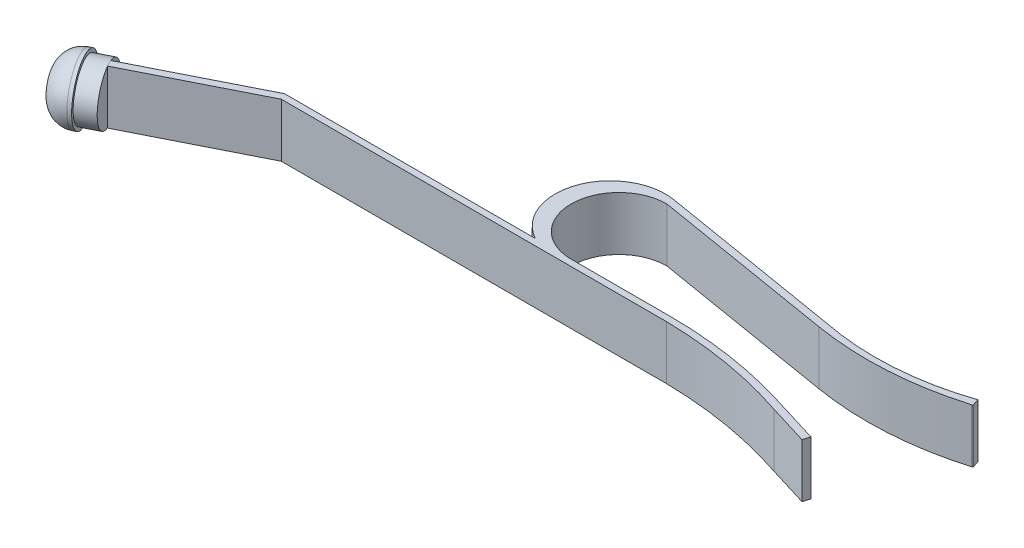
ISO-10303-21;
HEADER;
FILE_DESCRIPTION(('STEP AP214'),'2;1');
FILE_NAME('part.step','',(''),(''),'','','');
FILE_SCHEMA(('AUTOMOTIVE_DESIGN { 1 0 10303 214 1 1 1 1 }'));
ENDSEC;
DATA;
#1=APPLICATION_CONTEXT('core data for automotive mechanical design processes');
#2=APPLICATION_PROTOCOL_DEFINITION('international standard','automotive_design',2000,#1);
#3=PRODUCT_CONTEXT('',#1,'mechanical');
#4=PRODUCT('Part','Part','',(#3));
#5=PRODUCT_RELATED_PRODUCT_CATEGORY('part','',(#4));
#6=PRODUCT_DEFINITION_FORMATION('','',#4);
#7=PRODUCT_DEFINITION_CONTEXT('part definition',#1,'design');
#8=PRODUCT_DEFINITION('design','',#6,#7);
#9=PRODUCT_DEFINITION_SHAPE('','',#8);
#10=(LENGTH_UNIT() NAMED_UNIT(*) SI_UNIT(.MILLI.,.METRE.));
#11=(NAMED_UNIT(*) PLANE_ANGLE_UNIT() SI_UNIT($,.RADIAN.));
#12=(NAMED_UNIT(*) SI_UNIT($,.STERADIAN.) SOLID_ANGLE_UNIT());
#13=UNCERTAINTY_MEASURE_WITH_UNIT(LENGTH_MEASURE(1.E-05),#10,'distance_accuracy_value','');
#14=(GEOMETRIC_REPRESENTATION_CONTEXT(3) GLOBAL_UNCERTAINTY_ASSIGNED_CONTEXT((#13)) GLOBAL_UNIT_ASSIGNED_CONTEXT((#10,
#11,#12)) REPRESENTATION_CONTEXT('',''));
#15=CARTESIAN_POINT('',(0.,0.,0.));
#16=DIRECTION('',(0.,0.,1.));
#17=DIRECTION('',(1.,0.,0.));
#18=AXIS2_PLACEMENT_3D('',#15,#16,#17);
#19=CARTESIAN_POINT('',(-162.619391372233,7.50804054568903,19.8202176723908));
#20=DIRECTION('',(-0.893385957066227,0.,0.449290030733893));
#21=DIRECTION('',(0.449290030733893,0.,0.893385957066227));
#22=AXIS2_PLACEMENT_3D('',#19,#20,#21);
#23=DEGENERATE_TOROIDAL_SURFACE('',#22,2.4409494801451,6.,.T.);
#24=CARTESIAN_POINT('',(-167.979707114631,7.50804054568903,22.5159578567941));
#25=DIRECTION('',(-0.893385957066227,0.,0.449290030733893));
#26=DIRECTION('',(0.449290030733893,0.,0.893385957066227));
#27=AXIS2_PLACEMENT_3D('',#24,#25,#26);
#28=CIRCLE('',#27,2.4409494801451);
#29=CARTESIAN_POINT('',(-166.883012847676,7.50804054568903,24.6966678442639));
#30=VERTEX_POINT('',#29);
#31=EDGE_CURVE('E47',#30,#30,#28,.T.);
#32=ORIENTED_EDGE('',*,*,#31,.F.);
#33=EDGE_LOOP('',(#32));
#34=FACE_BOUND('',#33,.T.);
#35=CARTESIAN_POINT('',(-162.619391372233,7.50804054568903,19.8202176723908));
#36=DIRECTION('',(-0.893385957066227,0.,0.449290030733893));
#37=DIRECTION('',(0.449290030733893,0.,0.893385957066227));
#38=AXIS2_PLACEMENT_3D('',#35,#36,#37);
#39=CIRCLE('',#38,8.4409494801451);
#40=CARTESIAN_POINT('',(-158.826956920876,7.50804054568903,27.3612434022579));
#41=VERTEX_POINT('',#40);
#42=EDGE_CURVE('E11',#41,#41,#39,.F.);
#43=ORIENTED_EDGE('',*,*,#42,.F.);
#44=EDGE_LOOP('',(#43));
#45=FACE_BOUND('',#44,.T.);
#46=ADVANCED_FACE('F39',(#34,#45),#23,.T.);
#47=CARTESIAN_POINT('',(-157.707883988967,15.,16.2320493056686));
#48=DIRECTION('',(0.893385957066227,0.,-0.449290030733893));
#49=DIRECTION('',(-0.449290030733893,0.,-0.893385957066227));
#50=AXIS2_PLACEMENT_3D('',#47,#48,#49);
#51=PLANE('',#50);
#52=CARTESIAN_POINT('',(-157.259075629836,7.50804054568903,17.1244774879874));
#53=DIRECTION('',(-0.893385957066227,0.,0.449290030733893));
#54=DIRECTION('',(0.449290030733893,0.,0.893385957066227));
#55=AXIS2_PLACEMENT_3D('',#52,#53,#54);
#56=CIRCLE('',#55,7.49070603260002);
#57=CARTESIAN_POINT('',(-156.809303927499,14.931552623673,18.0188212198011));
#58=VERTEX_POINT('',#57);
#59=CARTESIAN_POINT('',(-157.707883988967,14.9318414497413,16.2320493056686));
#60=VERTEX_POINT('',#59);
#61=EDGE_CURVE('E210',#58,#60,#56,.T.);
#62=ORIENTED_EDGE('',*,*,#61,.F.);
#63=DIRECTION('',(0.,-1.,0.));
#64=VECTOR('',#63,1.);
#65=CARTESIAN_POINT('',(-156.809303927499,15.,18.0188212198011));
#66=LINE('',#65,#64);
#67=CARTESIAN_POINT('',(-156.809303927499,15.,18.0188212198011));
#68=VERTEX_POINT('',#67);
#69=EDGE_CURVE('E190',#68,#58,#66,.T.);
#70=ORIENTED_EDGE('',*,*,#69,.F.);
#71=DIRECTION('',(0.449290030733893,0.,0.893385957066227));
#72=VECTOR('',#71,1.);
#73=CARTESIAN_POINT('',(-157.707883988967,15.,16.2320493056686));
#74=LINE('',#73,#72);
#75=CARTESIAN_POINT('',(-157.707883988967,15.,16.2320493056686));
#76=VERTEX_POINT('',#75);
#77=EDGE_CURVE('E414',#76,#68,#74,.T.);
#78=ORIENTED_EDGE('',*,*,#77,.F.);
#79=DIRECTION('',(0.,-1.,0.));
#80=VECTOR('',#79,1.);
#81=CARTESIAN_POINT('',(-157.707883988967,15.,16.2320493056686));
#82=LINE('',#81,#80);
#83=EDGE_CURVE('E335',#76,#60,#82,.T.);
#84=ORIENTED_EDGE('',*,*,#83,.T.);
#85=EDGE_LOOP('',(#62,#70,#78,#84));
#86=FACE_BOUND('',#85,.T.);
#87=ADVANCED_FACE('F461',(#86),#51,.F.);
#88=CARTESIAN_POINT('',(-45.4314391268288,15.,-13.3557871081369));
#89=DIRECTION('',(0.,-1.,0.));
#90=DIRECTION('',(0.,0.,-1.));
#91=AXIS2_PLACEMENT_3D('',#88,#89,#90);
#92=CYLINDRICAL_SURFACE('',#91,13.3557871081369);
#93=CARTESIAN_POINT('',(-45.4314391268288,0.,-13.3557871081369));
#94=DIRECTION('',(0.,-1.,0.));
#95=DIRECTION('',(0.,0.,-1.));
#96=AXIS2_PLACEMENT_3D('',#93,#94,#95);
#97=CIRCLE('',#96,13.3557871081369);
#98=CARTESIAN_POINT('',(-45.4314391268288,0.,0.));
#99=VERTEX_POINT('',#98);
#100=CARTESIAN_POINT('',(-45.4314391268288,0.,-26.7115742162738));
#101=VERTEX_POINT('',#100);
#102=EDGE_CURVE('E234',#99,#101,#97,.T.);
#103=ORIENTED_EDGE('',*,*,#102,.T.);
#104=DIRECTION('',(0.,-1.,0.));
#105=VECTOR('',#104,1.);
#106=CARTESIAN_POINT('',(-45.4314391268288,15.,-26.7115742162738));
#107=LINE('',#106,#105);
#108=CARTESIAN_POINT('',(-45.4314391268288,15.,-26.7115742162738));
#109=VERTEX_POINT('',#108);
#110=EDGE_CURVE('E215',#109,#101,#107,.T.);
#111=ORIENTED_EDGE('',*,*,#110,.F.);
#112=CARTESIAN_POINT('',(-45.4314391268288,15.,-13.3557871081369));
#113=DIRECTION('',(0.,-1.,0.));
#114=DIRECTION('',(0.,0.,-1.));
#115=AXIS2_PLACEMENT_3D('',#112,#113,#114);
#116=CIRCLE('',#115,13.3557871081369);
#117=CARTESIAN_POINT('',(-45.4314391268288,15.,0.));
#118=VERTEX_POINT('',#117);
#119=EDGE_CURVE('E302',#118,#109,#116,.T.);
#120=ORIENTED_EDGE('',*,*,#119,.F.);
#121=DIRECTION('',(0.,-1.,0.));
#122=VECTOR('',#121,1.);
#123=CARTESIAN_POINT('',(-45.4314391268288,15.,0.));
#124=LINE('',#123,#122);
#125=EDGE_CURVE('E303',#118,#99,#124,.T.);
#126=ORIENTED_EDGE('',*,*,#125,.T.);
#127=EDGE_LOOP('',(#103,#111,#120,#126));
#128=FACE_BOUND('',#127,.T.);
#129=ADVANCED_FACE('F447',(#128),#92,.F.);
#130=CARTESIAN_POINT('',(-45.4314391268288,15.,-26.7115742162738));
#131=DIRECTION('',(0.163980210514114,0.,-0.986463628604596));
#132=DIRECTION('',(-0.986463628604596,0.,-0.163980210514114));
#133=AXIS2_PLACEMENT_3D('',#130,#131,#132);
#134=PLANE('',#133);
#135=DIRECTION('',(0.986463628604596,0.,0.163980210514114));
#136=VECTOR('',#135,1.);
#137=CARTESIAN_POINT('',(-45.4314391268288,0.,-26.7115742162738));
#138=LINE('',#137,#136);
#139=CARTESIAN_POINT('',(5.45092280961635,0.,-18.2533805435926));
#140=VERTEX_POINT('',#139);
#141=EDGE_CURVE('E239',#101,#140,#138,.T.);
#142=ORIENTED_EDGE('',*,*,#141,.T.);
#143=DIRECTION('',(0.,-1.,0.));
#144=VECTOR('',#143,1.);
#145=CARTESIAN_POINT('',(5.45092280961635,15.,-18.2533805435926));
#146=LINE('',#145,#144);
#147=CARTESIAN_POINT('',(5.45092280961635,15.,-18.2533805435926));
#148=VERTEX_POINT('',#147);
#149=EDGE_CURVE('E220',#148,#140,#146,.T.);
#150=ORIENTED_EDGE('',*,*,#149,.F.);
#151=DIRECTION('',(0.986463628604596,0.,0.163980210514114));
#152=VECTOR('',#151,1.);
#153=CARTESIAN_POINT('',(-45.4314391268288,15.,-26.7115742162738));
#154=LINE('',#153,#152);
#155=EDGE_CURVE('E449',#109,#148,#154,.T.);
#156=ORIENTED_EDGE('',*,*,#155,.F.);
#157=ORIENTED_EDGE('',*,*,#110,.T.);
#158=EDGE_LOOP('',(#142,#150,#156,#157));
#159=FACE_BOUND('',#158,.T.);
#160=ADVANCED_FACE('F453',(#159),#134,.F.);
#161=CARTESIAN_POINT('',(20.2091417558867,15.,-107.035107118006));
#162=DIRECTION('',(0.,-1.,0.));
#163=DIRECTION('',(0.,0.,-1.));
#164=AXIS2_PLACEMENT_3D('',#161,#162,#163);
#165=CYLINDRICAL_SURFACE('',#164,90.);
#166=CARTESIAN_POINT('',(20.2091417558867,0.,-107.035107118006));
#167=DIRECTION('',(0.,1.,0.));
#168=DIRECTION('',(0.,0.,1.));
#169=AXIS2_PLACEMENT_3D('',#166,#167,#168);
#170=CIRCLE('',#169,90.);
#171=CARTESIAN_POINT('',(45.5932894480546,0.,-20.6890299289283));
#172=VERTEX_POINT('',#171);
#173=EDGE_CURVE('E246',#140,#172,#170,.T.);
#174=ORIENTED_EDGE('',*,*,#173,.T.);
#175=DIRECTION('',(0.,-1.,0.));
#176=VECTOR('',#175,1.);
#177=CARTESIAN_POINT('',(45.5932894480546,15.,-20.6890299289283));
#178=LINE('',#177,#176);
#179=CARTESIAN_POINT('',(45.5932894480546,15.,-20.6890299289283));
#180=VERTEX_POINT('',#179);
#181=EDGE_CURVE('E362',#180,#172,#178,.T.);
#182=ORIENTED_EDGE('',*,*,#181,.F.);
#183=CARTESIAN_POINT('',(20.2091417558867,15.,-107.035107118006));
#184=DIRECTION('',(0.,1.,0.));
#185=DIRECTION('',(0.,0.,1.));
#186=AXIS2_PLACEMENT_3D('',#183,#184,#185);
#187=CIRCLE('',#186,90.);
#188=EDGE_CURVE('E374',#148,#180,#187,.T.);
#189=ORIENTED_EDGE('',*,*,#188,.F.);
#190=ORIENTED_EDGE('',*,*,#149,.T.);
#191=EDGE_LOOP('',(#174,#182,#189,#190));
#192=FACE_BOUND('',#191,.T.);
#193=ADVANCED_FACE('F372',(#192),#165,.T.);
#194=CARTESIAN_POINT('',(45.5932894480546,15.,-20.6890299289283));
#195=DIRECTION('',(-0.282046085468501,0.,-0.959400857656431));
#196=DIRECTION('',(-0.959400857656431,0.,0.282046085468501));
#197=AXIS2_PLACEMENT_3D('',#194,#195,#196);
#198=PLANE('',#197);
#199=DIRECTION('',(0.959400857656431,0.,-0.282046085468501));
#200=VECTOR('',#199,1.);
#201=CARTESIAN_POINT('',(45.5932894480546,0.,-20.6890299289283));
#202=LINE('',#201,#200);
#203=CARTESIAN_POINT('',(45.9403386357963,0.,-20.7910559632875));
#204=VERTEX_POINT('',#203);
#205=EDGE_CURVE('E254',#172,#204,#202,.T.);
#206=ORIENTED_EDGE('',*,*,#205,.T.);
#207=DIRECTION('',(0.,-1.,0.));
#208=VECTOR('',#207,1.);
#209=CARTESIAN_POINT('',(45.9403386357963,15.,-20.7910559632875));
#210=LINE('',#209,#208);
#211=CARTESIAN_POINT('',(45.9403386357963,15.,-20.7910559632875));
#212=VERTEX_POINT('',#211);
#213=EDGE_CURVE('E358',#212,#204,#210,.T.);
#214=ORIENTED_EDGE('',*,*,#213,.F.);
#215=DIRECTION('',(0.959400857656431,0.,-0.282046085468501));
#216=VECTOR('',#215,1.);
#217=CARTESIAN_POINT('',(45.5932894480546,15.,-20.6890299289283));
#218=LINE('',#217,#216);
#219=EDGE_CURVE('E394',#180,#212,#218,.T.);
#220=ORIENTED_EDGE('',*,*,#219,.F.);
#221=ORIENTED_EDGE('',*,*,#181,.T.);
#222=EDGE_LOOP('',(#206,#214,#220,#221));
#223=FACE_BOUND('',#222,.T.);
#224=ADVANCED_FACE('F383',(#223),#198,.F.);
#225=CARTESIAN_POINT('',(45.9403386357963,15.,-20.7910559632875));
#226=DIRECTION('',(-0.959400857656431,0.,0.282046085468501));
#227=DIRECTION('',(0.282046085468501,0.,0.959400857656431));
#228=AXIS2_PLACEMENT_3D('',#225,#226,#227);
#229=PLANE('',#228);
#230=DIRECTION('',(-0.282046085468501,0.,-0.959400857656431));
#231=VECTOR('',#230,1.);
#232=CARTESIAN_POINT('',(45.9403386357963,0.,-20.7910559632875));
#233=LINE('',#232,#231);
#234=CARTESIAN_POINT('',(45.3523756728333,0.,-22.7910559632876));
#235=VERTEX_POINT('',#234);
#236=EDGE_CURVE('E257',#204,#235,#233,.T.);
#237=ORIENTED_EDGE('',*,*,#236,.T.);
#238=DIRECTION('',(0.,-1.,0.));
#239=VECTOR('',#238,1.);
#240=CARTESIAN_POINT('',(45.3523756728333,15.,-22.7910559632876));
#241=LINE('',#240,#239);
#242=CARTESIAN_POINT('',(45.3523756728333,15.,-22.7910559632876));
#243=VERTEX_POINT('',#242);
#244=EDGE_CURVE('E354',#243,#235,#241,.T.);
#245=ORIENTED_EDGE('',*,*,#244,.F.);
#246=DIRECTION('',(-0.282046085468501,0.,-0.959400857656431));
#247=VECTOR('',#246,1.);
#248=CARTESIAN_POINT('',(45.9403386357963,15.,-20.7910559632875));
#249=LINE('',#248,#247);
#250=EDGE_CURVE('E389',#212,#243,#249,.T.);
#251=ORIENTED_EDGE('',*,*,#250,.F.);
#252=ORIENTED_EDGE('',*,*,#213,.T.);
#253=EDGE_LOOP('',(#237,#245,#251,#252));
#254=FACE_BOUND('',#253,.T.);
#255=ADVANCED_FACE('F387',(#254),#229,.F.);
#256=CARTESIAN_POINT('',(20.6871980269933,15.,-95.3334724912764));
#257=DIRECTION('',(0.,-1.,0.));
#258=DIRECTION('',(0.,0.,-1.));
#259=AXIS2_PLACEMENT_3D('',#256,#257,#258);
#260=CYLINDRICAL_SURFACE('',#259,76.6209709154163);
#261=CARTESIAN_POINT('',(20.6871980269933,0.,-95.3334724912764));
#262=DIRECTION('',(0.,-1.,0.));
#263=DIRECTION('',(0.,0.,1.));
#264=AXIS2_PLACEMENT_3D('',#261,#262,#263);
#265=CIRCLE('',#264,76.6209709154163);
#266=CARTESIAN_POINT('',(5.45092280961642,0.,-20.2426667856415));
#267=VERTEX_POINT('',#266);
#268=EDGE_CURVE('E260',#235,#267,#265,.T.);
#269=ORIENTED_EDGE('',*,*,#268,.T.);
#270=DIRECTION('',(0.,-1.,0.));
#271=VECTOR('',#270,1.);
#272=CARTESIAN_POINT('',(5.45092280961642,15.,-20.2426667856415));
#273=LINE('',#272,#271);
#274=CARTESIAN_POINT('',(5.45092280961642,15.,-20.2426667856415));
#275=VERTEX_POINT('',#274);
#276=EDGE_CURVE('E350',#275,#267,#273,.T.);
#277=ORIENTED_EDGE('',*,*,#276,.F.);
#278=CARTESIAN_POINT('',(20.6871980269933,15.,-95.3334724912764));
#279=DIRECTION('',(0.,-1.,0.));
#280=DIRECTION('',(0.,0.,1.));
#281=AXIS2_PLACEMENT_3D('',#278,#279,#280);
#282=CIRCLE('',#281,76.6209709154163);
#283=EDGE_CURVE('E393',#243,#275,#282,.T.);
#284=ORIENTED_EDGE('',*,*,#283,.F.);
#285=ORIENTED_EDGE('',*,*,#244,.T.);
#286=EDGE_LOOP('',(#269,#277,#284,#285));
#287=FACE_BOUND('',#286,.T.);
#288=ADVANCED_FACE('F538',(#287),#260,.F.);
#289=CARTESIAN_POINT('',(5.45092280961642,15.,-20.2426667856415));
#290=DIRECTION('',(-0.163980210514114,0.,0.986463628604596));
#291=DIRECTION('',(0.986463628604596,0.,0.163980210514114));
#292=AXIS2_PLACEMENT_3D('',#289,#290,#291);
#293=PLANE('',#292);
#294=DIRECTION('',(-0.986463628604596,0.,-0.163980210514114));
#295=VECTOR('',#294,1.);
#296=CARTESIAN_POINT('',(5.45092280961642,0.,-20.2426667856415));
#297=LINE('',#296,#295);
#298=CARTESIAN_POINT('',(-45.4958903951329,0.,-28.7115742162738));
#299=VERTEX_POINT('',#298);
#300=EDGE_CURVE('E263',#267,#299,#297,.T.);
#301=ORIENTED_EDGE('',*,*,#300,.T.);
#302=DIRECTION('',(0.,-1.,0.));
#303=VECTOR('',#302,1.);
#304=CARTESIAN_POINT('',(-45.4958903951329,15.,-28.7115742162738));
#305=LINE('',#304,#303);
#306=CARTESIAN_POINT('',(-45.4958903951329,15.,-28.7115742162738));
#307=VERTEX_POINT('',#306);
#308=EDGE_CURVE('E346',#307,#299,#305,.T.);
#309=ORIENTED_EDGE('',*,*,#308,.F.);
#310=DIRECTION('',(-0.986463628604596,0.,-0.163980210514114));
#311=VECTOR('',#310,1.);
#312=CARTESIAN_POINT('',(5.45092280961642,15.,-20.2426667856415));
#313=LINE('',#312,#311);
#314=EDGE_CURVE('E398',#275,#307,#313,.T.);
#315=ORIENTED_EDGE('',*,*,#314,.F.);
#316=ORIENTED_EDGE('',*,*,#276,.T.);
#317=EDGE_LOOP('',(#301,#309,#315,#316));
#318=FACE_BOUND('',#317,.T.);
#319=ADVANCED_FACE('F534',(#318),#293,.F.);
#320=CARTESIAN_POINT('',(-48.0223584581304,15.,-13.5129789396586));
#321=DIRECTION('',(0.,-1.,0.));
#322=DIRECTION('',(0.,0.,-1.));
#323=AXIS2_PLACEMENT_3D('',#320,#321,#322);
#324=CYLINDRICAL_SURFACE('',#323,15.4071522110901);
#325=CARTESIAN_POINT('',(-48.0223584581304,0.,-13.5129789396586));
#326=DIRECTION('',(0.,1.,0.));
#327=DIRECTION('',(0.,0.,1.));
#328=AXIS2_PLACEMENT_3D('',#325,#326,#327);
#329=CIRCLE('',#328,15.4071522110901);
#330=CARTESIAN_POINT('',(-55.4236920833659,0.,0.));
#331=VERTEX_POINT('',#330);
#332=EDGE_CURVE('E266',#299,#331,#329,.T.);
#333=ORIENTED_EDGE('',*,*,#332,.T.);
#334=DIRECTION('',(0.,-1.,0.));
#335=VECTOR('',#334,1.);
#336=CARTESIAN_POINT('',(-55.4236920833659,15.,0.));
#337=LINE('',#336,#335);
#338=CARTESIAN_POINT('',(-55.4236920833659,15.,0.));
#339=VERTEX_POINT('',#338);
#340=EDGE_CURVE('E342',#339,#331,#337,.T.);
#341=ORIENTED_EDGE('',*,*,#340,.F.);
#342=CARTESIAN_POINT('',(-48.0223584581304,15.,-13.5129789396586));
#343=DIRECTION('',(0.,1.,0.));
#344=DIRECTION('',(0.,0.,1.));
#345=AXIS2_PLACEMENT_3D('',#342,#343,#344);
#346=CIRCLE('',#345,15.4071522110901);
#347=EDGE_CURVE('E405',#307,#339,#346,.T.);
#348=ORIENTED_EDGE('',*,*,#347,.F.);
#349=ORIENTED_EDGE('',*,*,#308,.T.);
#350=EDGE_LOOP('',(#333,#341,#348,#349));
#351=FACE_BOUND('',#350,.T.);
#352=ADVANCED_FACE('F530',(#351),#324,.T.);
#353=CARTESIAN_POINT('',(-55.4236920833659,15.,0.));
#354=DIRECTION('',(0.,0.,1.));
#355=DIRECTION('',(1.,0.,0.));
#356=AXIS2_PLACEMENT_3D('',#353,#354,#355);
#357=PLANE('',#356);
#358=DIRECTION('',(-1.,0.,0.));
#359=VECTOR('',#358,1.);
#360=CARTESIAN_POINT('',(-55.4236920833659,0.,0.));
#361=LINE('',#360,#359);
#362=CARTESIAN_POINT('',(-125.431439126829,0.,0.));
#363=VERTEX_POINT('',#362);
#364=EDGE_CURVE('E269',#331,#363,#361,.T.);
#365=ORIENTED_EDGE('',*,*,#364,.T.);
#366=DIRECTION('',(0.,-1.,0.));
#367=VECTOR('',#366,1.);
#368=CARTESIAN_POINT('',(-125.431439126829,15.,0.));
#369=LINE('',#368,#367);
#370=CARTESIAN_POINT('',(-125.431439126829,15.,0.));
#371=VERTEX_POINT('',#370);
#372=EDGE_CURVE('E338',#371,#363,#369,.T.);
#373=ORIENTED_EDGE('',*,*,#372,.F.);
#374=DIRECTION('',(-1.,0.,0.));
#375=VECTOR('',#374,1.);
#376=CARTESIAN_POINT('',(-55.4236920833659,15.,0.));
#377=LINE('',#376,#375);
#378=EDGE_CURVE('E408',#339,#371,#377,.T.);
#379=ORIENTED_EDGE('',*,*,#378,.F.);
#380=ORIENTED_EDGE('',*,*,#340,.T.);
#381=EDGE_LOOP('',(#365,#373,#379,#380));
#382=FACE_BOUND('',#381,.T.);
#383=ADVANCED_FACE('F527',(#382),#357,.F.);
#384=CARTESIAN_POINT('',(-125.431439126829,15.,0.));
#385=DIRECTION('',(0.449290030733891,0.,0.893385957066227));
#386=DIRECTION('',(0.893385957066228,0.,-0.449290030733891));
#387=AXIS2_PLACEMENT_3D('',#384,#385,#386);
#388=PLANE('',#387);
#389=DIRECTION('',(-0.893385957066227,0.,0.449290030733891));
#390=VECTOR('',#389,1.);
#391=CARTESIAN_POINT('',(-125.431439126829,0.,0.));
#392=LINE('',#391,#390);
#393=CARTESIAN_POINT('',(-157.707883988967,0.,16.2320493056686));
#394=VERTEX_POINT('',#393);
#395=EDGE_CURVE('E272',#363,#394,#392,.T.);
#396=ORIENTED_EDGE('',*,*,#395,.T.);
#397=CARTESIAN_POINT('',(-157.707883988967,0.0842396416367583,16.2320493056686));
#398=VERTEX_POINT('',#397);
#399=EDGE_CURVE('E334',#398,#394,#82,.T.);
#400=ORIENTED_EDGE('',*,*,#399,.F.);
#401=EDGE_CURVE('E61',#60,#398,#82,.T.);
#402=ORIENTED_EDGE('',*,*,#401,.F.);
#403=ORIENTED_EDGE('',*,*,#83,.F.);
#404=DIRECTION('',(-0.893385957066227,0.,0.449290030733891));
#405=VECTOR('',#404,1.);
#406=CARTESIAN_POINT('',(-125.431439126829,15.,0.));
#407=LINE('',#406,#405);
#408=EDGE_CURVE('E411',#371,#76,#407,.T.);
#409=ORIENTED_EDGE('',*,*,#408,.F.);
#410=ORIENTED_EDGE('',*,*,#372,.T.);
#411=EDGE_LOOP('',(#396,#400,#402,#403,#409,#410));
#412=FACE_BOUND('',#411,.T.);
#413=ADVANCED_FACE('F524',(#412),#388,.F.);
#414=CARTESIAN_POINT('',(-156.809303927499,0.0845284677051094,18.0188212198011));
#415=VERTEX_POINT('',#414);
#416=EDGE_CURVE('E54',#398,#415,#56,.T.);
#417=ORIENTED_EDGE('',*,*,#416,.F.);
#418=ORIENTED_EDGE('',*,*,#399,.T.);
#419=DIRECTION('',(0.449290030733893,0.,0.893385957066227));
#420=VECTOR('',#419,1.);
#421=CARTESIAN_POINT('',(-157.707883988967,0.,16.2320493056686));
#422=LINE('',#421,#420);
#423=CARTESIAN_POINT('',(-156.809303927499,0.,18.0188212198011));
#424=VERTEX_POINT('',#423);
#425=EDGE_CURVE('E198',#394,#424,#422,.T.);
#426=ORIENTED_EDGE('',*,*,#425,.T.);
#427=EDGE_CURVE('E186',#415,#424,#66,.T.);
#428=ORIENTED_EDGE('',*,*,#427,.F.);
#429=EDGE_LOOP('',(#417,#418,#426,#428));
#430=FACE_BOUND('',#429,.T.);
#431=ADVANCED_FACE('F196',(#430),#51,.F.);
#432=CARTESIAN_POINT('',(-156.809303927499,15.,18.0188212198011));
#433=DIRECTION('',(-0.449290030733891,0.,-0.893385957066227));
#434=DIRECTION('',(-0.893385957066228,0.,0.449290030733891));
#435=AXIS2_PLACEMENT_3D('',#432,#433,#434);
#436=PLANE('',#435);
#437=DIRECTION('',(0.893385957066227,0.,-0.449290030733891));
#438=VECTOR('',#437,1.);
#439=CARTESIAN_POINT('',(-156.809303927499,0.,18.0188212198011));
#440=LINE('',#439,#438);
#441=CARTESIAN_POINT('',(-124.532859065361,0.,1.78677191413246));
#442=VERTEX_POINT('',#441);
#443=EDGE_CURVE('E278',#424,#442,#440,.T.);
#444=ORIENTED_EDGE('',*,*,#443,.T.);
#445=DIRECTION('',(0.,-1.,0.));
#446=VECTOR('',#445,1.);
#447=CARTESIAN_POINT('',(-124.532859065361,15.,1.78677191413246));
#448=LINE('',#447,#446);
#449=CARTESIAN_POINT('',(-124.532859065361,15.,1.78677191413246));
#450=VERTEX_POINT('',#449);
#451=EDGE_CURVE('E201',#450,#442,#448,.T.);
#452=ORIENTED_EDGE('',*,*,#451,.F.);
#453=DIRECTION('',(0.893385957066227,0.,-0.449290030733891));
#454=VECTOR('',#453,1.);
#455=CARTESIAN_POINT('',(-156.809303927499,15.,18.0188212198011));
#456=LINE('',#455,#454);
#457=EDGE_CURVE('E417',#68,#450,#456,.T.);
#458=ORIENTED_EDGE('',*,*,#457,.F.);
#459=ORIENTED_EDGE('',*,*,#69,.T.);
#460=EDGE_CURVE('E184',#58,#415,#66,.T.);
#461=ORIENTED_EDGE('',*,*,#460,.T.);
#462=ORIENTED_EDGE('',*,*,#427,.T.);
#463=EDGE_LOOP('',(#444,#452,#458,#459,#461,#462));
#464=FACE_BOUND('',#463,.T.);
#465=ADVANCED_FACE('F185',(#464),#436,.F.);
#466=CARTESIAN_POINT('',(-124.532859065361,15.,1.78677191413246));
#467=DIRECTION('',(0.,0.,-1.));
#468=DIRECTION('',(-1.,0.,0.));
#469=AXIS2_PLACEMENT_3D('',#466,#467,#468);
#470=PLANE('',#469);
#471=DIRECTION('',(1.,0.,0.));
#472=VECTOR('',#471,1.);
#473=CARTESIAN_POINT('',(-124.532859065361,0.,1.78677191413246));
#474=LINE('',#473,#472);
#475=CARTESIAN_POINT('',(-17.0687102207621,0.,1.78677191413246));
#476=VERTEX_POINT('',#475);
#477=EDGE_CURVE('E281',#442,#476,#474,.T.);
#478=ORIENTED_EDGE('',*,*,#477,.T.);
#479=DIRECTION('',(0.,-1.,0.));
#480=VECTOR('',#479,1.);
#481=CARTESIAN_POINT('',(-17.0687102207621,15.,1.78677191413246));
#482=LINE('',#481,#480);
#483=CARTESIAN_POINT('',(-17.0687102207621,15.,1.78677191413246));
#484=VERTEX_POINT('',#483);
#485=EDGE_CURVE('E326',#484,#476,#482,.T.);
#486=ORIENTED_EDGE('',*,*,#485,.F.);
#487=DIRECTION('',(1.,0.,0.));
#488=VECTOR('',#487,1.);
#489=CARTESIAN_POINT('',(-124.532859065361,15.,1.78677191413246));
#490=LINE('',#489,#488);
#491=EDGE_CURVE('E420',#450,#484,#490,.T.);
#492=ORIENTED_EDGE('',*,*,#491,.F.);
#493=ORIENTED_EDGE('',*,*,#451,.T.);
#494=EDGE_LOOP('',(#478,#486,#492,#493));
#495=FACE_BOUND('',#494,.T.);
#496=ADVANCED_FACE('F516',(#495),#470,.F.);
#497=CARTESIAN_POINT('',(-18.8736011084522,15.,121.773197683398));
#498=DIRECTION('',(0.,-1.,0.));
#499=DIRECTION('',(0.,0.,-1.));
#500=AXIS2_PLACEMENT_3D('',#497,#498,#499);
#501=CYLINDRICAL_SURFACE('',#500,120.);
#502=CARTESIAN_POINT('',(-18.8736011084522,0.,121.773197683398));
#503=DIRECTION('',(0.,-1.,0.));
#504=DIRECTION('',(0.,0.,-1.));
#505=AXIS2_PLACEMENT_3D('',#502,#503,#504);
#506=CIRCLE('',#505,120.);
#507=CARTESIAN_POINT('',(19.1909095719926,0.,7.9703285338979));
#508=VERTEX_POINT('',#507);
#509=EDGE_CURVE('E284',#476,#508,#506,.T.);
#510=ORIENTED_EDGE('',*,*,#509,.T.);
#511=DIRECTION('',(0.,-1.,0.));
#512=VECTOR('',#511,1.);
#513=CARTESIAN_POINT('',(19.1909095719926,15.,7.9703285338979));
#514=LINE('',#513,#512);
#515=CARTESIAN_POINT('',(19.1909095719926,15.,7.9703285338979));
#516=VERTEX_POINT('',#515);
#517=EDGE_CURVE('E322',#516,#508,#514,.T.);
#518=ORIENTED_EDGE('',*,*,#517,.F.);
#519=CARTESIAN_POINT('',(-18.8736011084522,15.,121.773197683398));
#520=DIRECTION('',(0.,-1.,0.));
#521=DIRECTION('',(0.,0.,-1.));
#522=AXIS2_PLACEMENT_3D('',#519,#520,#521);
#523=CIRCLE('',#522,120.);
#524=EDGE_CURVE('E423',#484,#516,#523,.T.);
#525=ORIENTED_EDGE('',*,*,#524,.F.);
#526=ORIENTED_EDGE('',*,*,#485,.T.);
#527=EDGE_LOOP('',(#510,#518,#525,#526));
#528=FACE_BOUND('',#527,.T.);
#529=ADVANCED_FACE('F512',(#528),#501,.F.);
#530=CARTESIAN_POINT('',(19.1909095719926,15.,7.9703285338979));
#531=DIRECTION('',(0.292888769729002,0.,-0.956146520448948));
#532=DIRECTION('',(-0.956146520448949,0.,-0.292888769729002));
#533=AXIS2_PLACEMENT_3D('',#530,#531,#532);
#534=PLANE('',#533);
#535=DIRECTION('',(0.956146520448948,0.,0.292888769729002));
#536=VECTOR('',#535,1.);
#537=CARTESIAN_POINT('',(19.1909095719926,0.,7.9703285338979));
#538=LINE('',#537,#536);
#539=CARTESIAN_POINT('',(30.4103095418553,0.,11.4070782202616));
#540=VERTEX_POINT('',#539);
#541=EDGE_CURVE('E287',#508,#540,#538,.T.);
#542=ORIENTED_EDGE('',*,*,#541,.T.);
#543=DIRECTION('',(0.,-1.,0.));
#544=VECTOR('',#543,1.);
#545=CARTESIAN_POINT('',(30.4103095418553,15.,11.4070782202616));
#546=LINE('',#545,#544);
#547=CARTESIAN_POINT('',(30.4103095418553,15.,11.4070782202616));
#548=VERTEX_POINT('',#547);
#549=EDGE_CURVE('E318',#548,#540,#546,.T.);
#550=ORIENTED_EDGE('',*,*,#549,.F.);
#551=DIRECTION('',(0.956146520448948,0.,0.292888769729002));
#552=VECTOR('',#551,1.);
#553=CARTESIAN_POINT('',(19.1909095719926,15.,7.9703285338979));
#554=LINE('',#553,#552);
#555=EDGE_CURVE('E426',#516,#548,#554,.T.);
#556=ORIENTED_EDGE('',*,*,#555,.F.);
#557=ORIENTED_EDGE('',*,*,#517,.T.);
#558=EDGE_LOOP('',(#542,#550,#556,#557));
#559=FACE_BOUND('',#558,.T.);
#560=ADVANCED_FACE('F508',(#559),#534,.F.);
#561=CARTESIAN_POINT('',(30.9960870813133,15.,9.49478517936371));
#562=DIRECTION('',(-0.956146520448948,0.,-0.292888769729003));
#563=DIRECTION('',(-0.292888769729003,0.,0.956146520448948));
#564=AXIS2_PLACEMENT_3D('',#561,#562,#563);
#565=PLANE('',#564);
#566=DIRECTION('',(0.292888769729003,0.,-0.956146520448948));
#567=VECTOR('',#566,1.);
#568=CARTESIAN_POINT('',(30.9960870813133,0.,9.49478517936371));
#569=LINE('',#568,#567);
#570=CARTESIAN_POINT('',(30.9960870813133,0.,9.49478517936371));
#571=VERTEX_POINT('',#570);
#572=EDGE_CURVE('E290',#540,#571,#569,.T.);
#573=ORIENTED_EDGE('',*,*,#572,.T.);
#574=DIRECTION('',(0.,-1.,0.));
#575=VECTOR('',#574,1.);
#576=CARTESIAN_POINT('',(30.9960870813133,15.,9.49478517936371));
#577=LINE('',#576,#575);
#578=CARTESIAN_POINT('',(30.9960870813133,15.,9.49478517936371));
#579=VERTEX_POINT('',#578);
#580=EDGE_CURVE('E314',#579,#571,#577,.T.);
#581=ORIENTED_EDGE('',*,*,#580,.F.);
#582=DIRECTION('',(0.292888769729003,0.,-0.956146520448948));
#583=VECTOR('',#582,1.);
#584=CARTESIAN_POINT('',(30.9960870813133,15.,9.49478517936371));
#585=LINE('',#584,#583);
#586=EDGE_CURVE('E429',#548,#579,#585,.T.);
#587=ORIENTED_EDGE('',*,*,#586,.F.);
#588=ORIENTED_EDGE('',*,*,#549,.T.);
#589=EDGE_LOOP('',(#573,#581,#587,#588));
#590=FACE_BOUND('',#589,.T.);
#591=ADVANCED_FACE('F504',(#590),#565,.F.);
#592=CARTESIAN_POINT('',(17.1793620852504,15.,5.26241754612619));
#593=DIRECTION('',(-0.292888769729002,0.,0.956146520448948));
#594=DIRECTION('',(0.956146520448949,0.,0.292888769729002));
#595=AXIS2_PLACEMENT_3D('',#592,#593,#594);
#596=PLANE('',#595);
#597=DIRECTION('',(-0.956146520448949,0.,-0.292888769729002));
#598=VECTOR('',#597,1.);
#599=CARTESIAN_POINT('',(17.1793620852504,0.,5.26241754612619));
#600=LINE('',#599,#598);
#601=CARTESIAN_POINT('',(17.1793620852504,0.,5.2624175461262));
#602=VERTEX_POINT('',#601);
#603=EDGE_CURVE('E293',#571,#602,#600,.T.);
#604=ORIENTED_EDGE('',*,*,#603,.T.);
#605=DIRECTION('',(0.,-1.,0.));
#606=VECTOR('',#605,1.);
#607=CARTESIAN_POINT('',(17.1793620852504,15.,5.2624175461262));
#608=LINE('',#607,#606);
#609=CARTESIAN_POINT('',(17.1793620852504,15.,5.2624175461262));
#610=VERTEX_POINT('',#609);
#611=EDGE_CURVE('E310',#610,#602,#608,.T.);
#612=ORIENTED_EDGE('',*,*,#611,.F.);
#613=DIRECTION('',(-0.956146520448949,0.,-0.292888769729002));
#614=VECTOR('',#613,1.);
#615=CARTESIAN_POINT('',(17.1793620852504,15.,5.26241754612619));
#616=LINE('',#615,#614);
#617=EDGE_CURVE('E432',#579,#610,#616,.T.);
#618=ORIENTED_EDGE('',*,*,#617,.F.);
#619=ORIENTED_EDGE('',*,*,#580,.T.);
#620=EDGE_LOOP('',(#604,#612,#618,#619));
#621=FACE_BOUND('',#620,.T.);
#622=ADVANCED_FACE('F500',(#621),#596,.F.);
#623=CARTESIAN_POINT('',(-17.9672902822299,15.,120.));
#624=DIRECTION('',(0.,-1.,0.));
#625=DIRECTION('',(0.,0.,-1.));
#626=AXIS2_PLACEMENT_3D('',#623,#624,#625);
#627=CYLINDRICAL_SURFACE('',#626,120.);
#628=CARTESIAN_POINT('',(-17.9672902822299,0.,120.));
#629=DIRECTION('',(0.,1.,0.));
#630=DIRECTION('',(0.,0.,-1.));
#631=AXIS2_PLACEMENT_3D('',#628,#629,#630);
#632=CIRCLE('',#631,120.);
#633=CARTESIAN_POINT('',(-17.9672902822299,0.,0.));
#634=VERTEX_POINT('',#633);
#635=EDGE_CURVE('E296',#602,#634,#632,.T.);
#636=ORIENTED_EDGE('',*,*,#635,.T.);
#637=DIRECTION('',(0.,-1.,0.));
#638=VECTOR('',#637,1.);
#639=CARTESIAN_POINT('',(-17.9672902822299,15.,0.));
#640=LINE('',#639,#638);
#641=CARTESIAN_POINT('',(-17.9672902822299,15.,0.));
#642=VERTEX_POINT('',#641);
#643=EDGE_CURVE('E306',#642,#634,#640,.T.);
#644=ORIENTED_EDGE('',*,*,#643,.F.);
#645=CARTESIAN_POINT('',(-17.9672902822299,15.,120.));
#646=DIRECTION('',(0.,1.,0.));
#647=DIRECTION('',(0.,0.,-1.));
#648=AXIS2_PLACEMENT_3D('',#645,#646,#647);
#649=CIRCLE('',#648,120.);
#650=EDGE_CURVE('E434',#610,#642,#649,.T.);
#651=ORIENTED_EDGE('',*,*,#650,.F.);
#652=ORIENTED_EDGE('',*,*,#611,.T.);
#653=EDGE_LOOP('',(#636,#644,#651,#652));
#654=FACE_BOUND('',#653,.T.);
#655=ADVANCED_FACE('F497',(#654),#627,.T.);
#656=CARTESIAN_POINT('',(-17.9672902822299,15.,0.));
#657=DIRECTION('',(0.,0.,1.));
#658=DIRECTION('',(1.,0.,0.));
#659=AXIS2_PLACEMENT_3D('',#656,#657,#658);
#660=PLANE('',#659);
#661=DIRECTION('',(-1.,0.,0.));
#662=VECTOR('',#661,1.);
#663=CARTESIAN_POINT('',(-17.9672902822299,0.,0.));
#664=LINE('',#663,#662);
#665=EDGE_CURVE('E299',#634,#99,#664,.T.);
#666=ORIENTED_EDGE('',*,*,#665,.T.);
#667=ORIENTED_EDGE('',*,*,#125,.F.);
#668=DIRECTION('',(-1.,0.,0.));
#669=VECTOR('',#668,1.);
#670=CARTESIAN_POINT('',(-17.9672902822299,15.,0.));
#671=LINE('',#670,#669);
#672=EDGE_CURVE('E249',#642,#118,#671,.T.);
#673=ORIENTED_EDGE('',*,*,#672,.F.);
#674=ORIENTED_EDGE('',*,*,#643,.T.);
#675=EDGE_LOOP('',(#666,#667,#673,#674));
#676=FACE_BOUND('',#675,.T.);
#677=ADVANCED_FACE('F445',(#676),#660,.F.);
#678=CARTESIAN_POINT('',(-45.4314391268288,15.,-13.3557871081369));
#679=DIRECTION('',(0.,-1.,0.));
#680=DIRECTION('',(0.,0.,-1.));
#681=AXIS2_PLACEMENT_3D('',#678,#679,#680);
#682=PLANE('',#681);
#683=ORIENTED_EDGE('',*,*,#119,.T.);
#684=ORIENTED_EDGE('',*,*,#155,.T.);
#685=ORIENTED_EDGE('',*,*,#188,.T.);
#686=ORIENTED_EDGE('',*,*,#219,.T.);
#687=ORIENTED_EDGE('',*,*,#250,.T.);
#688=ORIENTED_EDGE('',*,*,#283,.T.);
#689=ORIENTED_EDGE('',*,*,#314,.T.);
#690=ORIENTED_EDGE('',*,*,#347,.T.);
#691=ORIENTED_EDGE('',*,*,#378,.T.);
#692=ORIENTED_EDGE('',*,*,#408,.T.);
#693=ORIENTED_EDGE('',*,*,#77,.T.);
#694=ORIENTED_EDGE('',*,*,#457,.T.);
#695=ORIENTED_EDGE('',*,*,#491,.T.);
#696=ORIENTED_EDGE('',*,*,#524,.T.);
#697=ORIENTED_EDGE('',*,*,#555,.T.);
#698=ORIENTED_EDGE('',*,*,#586,.T.);
#699=ORIENTED_EDGE('',*,*,#617,.T.);
#700=ORIENTED_EDGE('',*,*,#650,.T.);
#701=ORIENTED_EDGE('',*,*,#672,.T.);
#702=EDGE_LOOP('',(#683,#684,#685,#686,#687,#688,#689,#690,#691,#692,#693,#694,#695,#696,#697,
#698,#699,#700,#701));
#703=FACE_BOUND('',#702,.T.);
#704=ADVANCED_FACE('F442',(#703),#682,.F.);
#705=CARTESIAN_POINT('',(-45.4314391268288,0.,-13.3557871081369));
#706=DIRECTION('',(0.,-1.,0.));
#707=DIRECTION('',(0.,0.,-1.));
#708=AXIS2_PLACEMENT_3D('',#705,#706,#707);
#709=PLANE('',#708);
#710=ORIENTED_EDGE('',*,*,#102,.F.);
#711=ORIENTED_EDGE('',*,*,#665,.F.);
#712=ORIENTED_EDGE('',*,*,#635,.F.);
#713=ORIENTED_EDGE('',*,*,#603,.F.);
#714=ORIENTED_EDGE('',*,*,#572,.F.);
#715=ORIENTED_EDGE('',*,*,#541,.F.);
#716=ORIENTED_EDGE('',*,*,#509,.F.);
#717=ORIENTED_EDGE('',*,*,#477,.F.);
#718=ORIENTED_EDGE('',*,*,#443,.F.);
#719=ORIENTED_EDGE('',*,*,#425,.F.);
#720=ORIENTED_EDGE('',*,*,#395,.F.);
#721=ORIENTED_EDGE('',*,*,#364,.F.);
#722=ORIENTED_EDGE('',*,*,#332,.F.);
#723=ORIENTED_EDGE('',*,*,#300,.F.);
#724=ORIENTED_EDGE('',*,*,#268,.F.);
#725=ORIENTED_EDGE('',*,*,#236,.F.);
#726=ORIENTED_EDGE('',*,*,#205,.F.);
#727=ORIENTED_EDGE('',*,*,#173,.F.);
#728=ORIENTED_EDGE('',*,*,#141,.F.);
#729=EDGE_LOOP('',(#710,#711,#712,#713,#714,#715,#716,#717,#718,#719,#720,#721,#722,#723,#724,
#725,#726,#727,#728));
#730=FACE_BOUND('',#729,.T.);
#731=ADVANCED_FACE('F378',(#730),#709,.T.);
#732=CARTESIAN_POINT('',(-157.259075629836,7.50804054568903,17.1244774879874));
#733=DIRECTION('',(-0.893385957066227,0.,0.449290030733893));
#734=DIRECTION('',(0.449290030733893,0.,0.893385957066227));
#735=AXIS2_PLACEMENT_3D('',#732,#733,#734);
#736=PLANE('',#735);
#737=EDGE_CURVE('E207',#60,#398,#56,.T.);
#738=ORIENTED_EDGE('',*,*,#737,.F.);
#739=ORIENTED_EDGE('',*,*,#401,.T.);
#740=EDGE_LOOP('',(#738,#739));
#741=FACE_BOUND('',#740,.T.);
#742=ADVANCED_FACE('F485',(#741),#736,.F.);
#743=CARTESIAN_POINT('',(-161.726005415167,7.50804054568903,19.3709276416569));
#744=DIRECTION('',(0.893385957066227,0.,-0.449290030733893));
#745=DIRECTION('',(-0.449290030733893,0.,-0.893385957066227));
#746=AXIS2_PLACEMENT_3D('',#743,#744,#745);
#747=CYLINDRICAL_SURFACE('',#746,7.49070603260002);
#748=CARTESIAN_POINT('',(-161.726005415167,7.50804054568903,19.3709276416569));
#749=DIRECTION('',(-0.893385957066227,0.,0.449290030733893));
#750=DIRECTION('',(0.449290030733893,0.,0.893385957066227));
#751=AXIS2_PLACEMENT_3D('',#748,#749,#750);
#752=CIRCLE('',#751,7.49070603260002);
#753=CARTESIAN_POINT('',(-158.360505871562,7.50804054568903,26.063019219693));
#754=VERTEX_POINT('',#753);
#755=EDGE_CURVE('E225',#754,#754,#752,.T.);
#756=ORIENTED_EDGE('',*,*,#755,.F.);
#757=EDGE_LOOP('',(#756));
#758=FACE_BOUND('',#757,.T.);
#759=ORIENTED_EDGE('',*,*,#61,.T.);
#760=ORIENTED_EDGE('',*,*,#737,.T.);
#761=ORIENTED_EDGE('',*,*,#416,.T.);
#762=EDGE_CURVE('E202',#415,#58,#56,.T.);
#763=ORIENTED_EDGE('',*,*,#762,.T.);
#764=EDGE_LOOP('',(#759,#760,#761,#763));
#765=FACE_BOUND('',#764,.T.);
#766=ADVANCED_FACE('F212',(#758,#765),#747,.T.);
#767=ORIENTED_EDGE('',*,*,#460,.F.);
#768=ORIENTED_EDGE('',*,*,#762,.F.);
#769=EDGE_LOOP('',(#767,#768));
#770=FACE_BOUND('',#769,.T.);
#771=ADVANCED_FACE('F203',(#770),#736,.F.);
#772=CARTESIAN_POINT('',(-167.979707114631,7.50804054568903,22.5159578567941));
#773=DIRECTION('',(0.893385957066227,0.,-0.449290030733893));
#774=DIRECTION('',(-0.449290030733893,0.,-0.893385957066227));
#775=AXIS2_PLACEMENT_3D('',#772,#773,#774);
#776=CYLINDRICAL_SURFACE('',#775,8.4409494801451);
#777=ORIENTED_EDGE('',*,*,#42,.T.);
#778=EDGE_LOOP('',(#777));
#779=FACE_BOUND('',#778,.T.);
#780=CARTESIAN_POINT('',(-161.726005415167,7.50804054568903,19.3709276416569));
#781=DIRECTION('',(-0.893385957066227,0.,0.449290030733893));
#782=DIRECTION('',(0.449290030733893,0.,0.893385957066227));
#783=AXIS2_PLACEMENT_3D('',#780,#781,#782);
#784=CIRCLE('',#783,8.4409494801451);
#785=CARTESIAN_POINT('',(-157.93357096381,7.50804054568903,26.911953371524));
#786=VERTEX_POINT('',#785);
#787=EDGE_CURVE('E208',#786,#786,#784,.T.);
#788=ORIENTED_EDGE('',*,*,#787,.T.);
#789=EDGE_LOOP('',(#788));
#790=FACE_BOUND('',#789,.T.);
#791=ADVANCED_FACE('F473',(#779,#790),#776,.T.);
#792=CARTESIAN_POINT('',(-167.979707114631,7.50804054568903,22.5159578567941));
#793=DIRECTION('',(-0.893385957066227,0.,0.449290030733893));
#794=DIRECTION('',(0.449290030733893,0.,0.893385957066227));
#795=AXIS2_PLACEMENT_3D('',#792,#793,#794);
#796=PLANE('',#795);
#797=ORIENTED_EDGE('',*,*,#31,.T.);
#798=EDGE_LOOP('',(#797));
#799=FACE_BOUND('',#798,.T.);
#800=ADVANCED_FACE('F475',(#799),#796,.T.);
#801=CARTESIAN_POINT('',(-161.726005415167,7.50804054568903,19.3709276416569));
#802=DIRECTION('',(-0.893385957066227,0.,0.449290030733893));
#803=DIRECTION('',(0.449290030733893,0.,0.893385957066227));
#804=AXIS2_PLACEMENT_3D('',#801,#802,#803);
#805=PLANE('',#804);
#806=ORIENTED_EDGE('',*,*,#755,.T.);
#807=EDGE_LOOP('',(#806));
#808=FACE_BOUND('',#807,.T.);
#809=ORIENTED_EDGE('',*,*,#787,.F.);
#810=EDGE_LOOP('',(#809));
#811=FACE_BOUND('',#810,.T.);
#812=ADVANCED_FACE('F481',(#808,#811),#805,.F.);
#813=CLOSED_SHELL('',(#46,#87,#129,#160,#193,#224,#255,#288,#319,#352,#383,#413,#431,#465,#496,
#529,#560,#591,#622,#655,#677,#704,#731,#742,#766,#771,#791,#800,#812));
#814=MANIFOLD_SOLID_BREP('B2',#813);
#815=ADVANCED_BREP_SHAPE_REPRESENTATION('',(#18,#814),#14);
#816=SHAPE_DEFINITION_REPRESENTATION(#9,#815);
ENDSEC;
END-ISO-10303-21;
